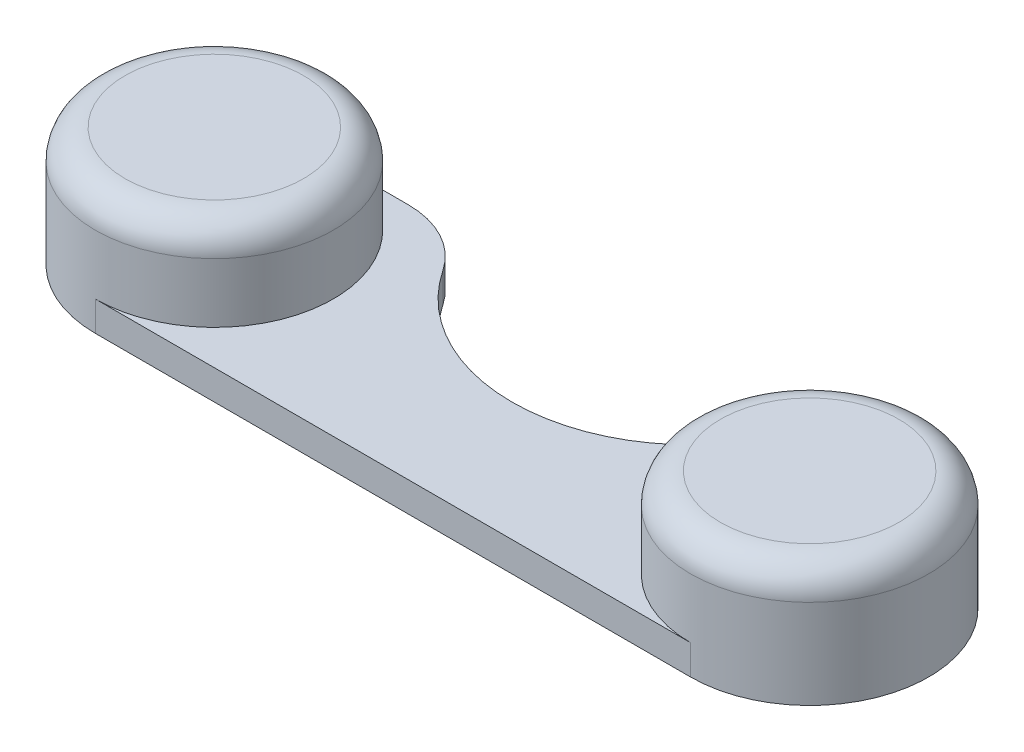
ISO-10303-21;
HEADER;
FILE_DESCRIPTION(('STEP AP214'),'2;1');
FILE_NAME('part.step','',(''),(''),'','','');
FILE_SCHEMA(('AUTOMOTIVE_DESIGN { 1 0 10303 214 1 1 1 1 }'));
ENDSEC;
DATA;
#1=APPLICATION_CONTEXT('core data for automotive mechanical design processes');
#2=APPLICATION_PROTOCOL_DEFINITION('international standard','automotive_design',2000,#1);
#3=PRODUCT_CONTEXT('',#1,'mechanical');
#4=PRODUCT('Part','Part','',(#3));
#5=PRODUCT_RELATED_PRODUCT_CATEGORY('part','',(#4));
#6=PRODUCT_DEFINITION_FORMATION('','',#4);
#7=PRODUCT_DEFINITION_CONTEXT('part definition',#1,'design');
#8=PRODUCT_DEFINITION('design','',#6,#7);
#9=PRODUCT_DEFINITION_SHAPE('','',#8);
#10=(LENGTH_UNIT() NAMED_UNIT(*) SI_UNIT(.MILLI.,.METRE.));
#11=(NAMED_UNIT(*) PLANE_ANGLE_UNIT() SI_UNIT($,.RADIAN.));
#12=(NAMED_UNIT(*) SI_UNIT($,.STERADIAN.) SOLID_ANGLE_UNIT());
#13=UNCERTAINTY_MEASURE_WITH_UNIT(LENGTH_MEASURE(1.E-05),#10,'distance_accuracy_value','');
#14=(GEOMETRIC_REPRESENTATION_CONTEXT(3) GLOBAL_UNCERTAINTY_ASSIGNED_CONTEXT((#13)) GLOBAL_UNIT_ASSIGNED_CONTEXT((#10,
#11,#12)) REPRESENTATION_CONTEXT('',''));
#15=CARTESIAN_POINT('',(0.,0.,0.));
#16=DIRECTION('',(0.,0.,1.));
#17=DIRECTION('',(1.,0.,0.));
#18=AXIS2_PLACEMENT_3D('',#15,#16,#17);
#19=CARTESIAN_POINT('',(0.,1.,-4.));
#20=DIRECTION('',(0.,0.,-1.));
#21=DIRECTION('',(-1.,0.,0.));
#22=AXIS2_PLACEMENT_3D('',#19,#20,#21);
#23=PLANE('',#22);
#24=DIRECTION('',(1.,0.,0.));
#25=VECTOR('',#24,1.);
#26=CARTESIAN_POINT('',(0.,1.,-4.));
#27=LINE('',#26,#25);
#28=CARTESIAN_POINT('',(0.,1.,-4.));
#29=VERTEX_POINT('',#28);
#30=CARTESIAN_POINT('',(2.51668522645212,1.,-4.));
#31=VERTEX_POINT('',#30);
#32=EDGE_CURVE('E127',#29,#31,#27,.T.);
#33=ORIENTED_EDGE('',*,*,#32,.T.);
#34=DIRECTION('',(0.,-1.,0.));
#35=VECTOR('',#34,1.);
#36=CARTESIAN_POINT('',(2.51668522645212,0.,-4.));
#37=LINE('',#36,#35);
#38=CARTESIAN_POINT('',(2.51668522645212,0.,-4.));
#39=VERTEX_POINT('',#38);
#40=EDGE_CURVE('E56',#31,#39,#37,.T.);
#41=ORIENTED_EDGE('',*,*,#40,.T.);
#42=DIRECTION('',(1.,0.,0.));
#43=VECTOR('',#42,1.);
#44=CARTESIAN_POINT('',(0.,0.,-4.));
#45=LINE('',#44,#43);
#46=CARTESIAN_POINT('',(0.,0.,-4.));
#47=VERTEX_POINT('',#46);
#48=EDGE_CURVE('E125',#47,#39,#45,.T.);
#49=ORIENTED_EDGE('',*,*,#48,.F.);
#50=DIRECTION('',(0.,-1.,0.));
#51=VECTOR('',#50,1.);
#52=CARTESIAN_POINT('',(0.,1.,-4.));
#53=LINE('',#52,#51);
#54=EDGE_CURVE('E135',#29,#47,#53,.T.);
#55=ORIENTED_EDGE('',*,*,#54,.F.);
#56=EDGE_LOOP('',(#33,#41,#49,#55));
#57=FACE_BOUND('',#56,.T.);
#58=ADVANCED_FACE('F33',(#57),#23,.T.);
#59=CARTESIAN_POINT('',(0.,4.,0.));
#60=DIRECTION('',(0.,-1.,0.));
#61=DIRECTION('',(0.,0.,-1.));
#62=AXIS2_PLACEMENT_3D('',#59,#60,#61);
#63=CYLINDRICAL_SURFACE('',#62,4.);
#64=CARTESIAN_POINT('',(0.,3.,0.));
#65=DIRECTION('',(0.,1.,0.));
#66=DIRECTION('',(0.,0.,1.));
#67=AXIS2_PLACEMENT_3D('',#64,#65,#66);
#68=CIRCLE('',#67,4.);
#69=CARTESIAN_POINT('',(0.,3.,4.));
#70=VERTEX_POINT('',#69);
#71=EDGE_CURVE('E143',#70,#70,#68,.F.);
#72=ORIENTED_EDGE('',*,*,#71,.T.);
#73=EDGE_LOOP('',(#72));
#74=FACE_BOUND('',#73,.T.);
#75=DIRECTION('',(0.,-1.,0.));
#76=VECTOR('',#75,1.);
#77=CARTESIAN_POINT('',(0.,1.,4.));
#78=LINE('',#77,#76);
#79=CARTESIAN_POINT('',(0.,1.,4.));
#80=VERTEX_POINT('',#79);
#81=CARTESIAN_POINT('',(0.,0.,4.));
#82=VERTEX_POINT('',#81);
#83=EDGE_CURVE('E112',#80,#82,#78,.T.);
#84=ORIENTED_EDGE('',*,*,#83,.F.);
#85=CARTESIAN_POINT('',(0.,1.,0.));
#86=DIRECTION('',(0.,1.,0.));
#87=DIRECTION('',(0.,0.,1.));
#88=AXIS2_PLACEMENT_3D('',#85,#86,#87);
#89=CIRCLE('',#88,4.);
#90=EDGE_CURVE('E146',#80,#29,#89,.T.);
#91=ORIENTED_EDGE('',*,*,#90,.T.);
#92=ORIENTED_EDGE('',*,*,#54,.T.);
#93=CARTESIAN_POINT('',(0.,0.,0.));
#94=DIRECTION('',(0.,1.,0.));
#95=DIRECTION('',(0.,0.,1.));
#96=AXIS2_PLACEMENT_3D('',#93,#94,#95);
#97=CIRCLE('',#96,4.);
#98=EDGE_CURVE('E132',#47,#82,#97,.T.);
#99=ORIENTED_EDGE('',*,*,#98,.T.);
#100=EDGE_LOOP('',(#84,#91,#92,#99));
#101=FACE_BOUND('',#100,.T.);
#102=ADVANCED_FACE('F201',(#74,#101),#63,.T.);
#103=CARTESIAN_POINT('',(0.,4.,0.));
#104=DIRECTION('',(0.,1.,0.));
#105=DIRECTION('',(0.,0.,1.));
#106=AXIS2_PLACEMENT_3D('',#103,#104,#105);
#107=PLANE('',#106);
#108=CARTESIAN_POINT('',(0.,4.,0.));
#109=DIRECTION('',(0.,1.,0.));
#110=DIRECTION('',(0.,0.,1.));
#111=AXIS2_PLACEMENT_3D('',#108,#109,#110);
#112=CIRCLE('',#111,3.);
#113=CARTESIAN_POINT('',(0.,4.,3.));
#114=VERTEX_POINT('',#113);
#115=EDGE_CURVE('E140',#114,#114,#112,.T.);
#116=ORIENTED_EDGE('',*,*,#115,.T.);
#117=EDGE_LOOP('',(#116));
#118=FACE_BOUND('',#117,.T.);
#119=ADVANCED_FACE('F207',(#118),#107,.T.);
#120=CARTESIAN_POINT('',(0.,0.,0.));
#121=DIRECTION('',(0.,1.,0.));
#122=DIRECTION('',(0.,0.,1.));
#123=AXIS2_PLACEMENT_3D('',#120,#121,#122);
#124=PLANE('',#123);
#125=ORIENTED_EDGE('',*,*,#48,.T.);
#126=CARTESIAN_POINT('',(2.51668522645212,0.,-1.));
#127=DIRECTION('',(0.,1.,0.));
#128=DIRECTION('',(0.,0.,1.));
#129=AXIS2_PLACEMENT_3D('',#126,#127,#128);
#130=CIRCLE('',#129,3.);
#131=CARTESIAN_POINT('',(5.01112348430141,0.,-2.66666666666667));
#132=VERTEX_POINT('',#131);
#133=EDGE_CURVE('E41',#39,#132,#130,.F.);
#134=ORIENTED_EDGE('',*,*,#133,.T.);
#135=CARTESIAN_POINT('',(10.,0.,-6.));
#136=DIRECTION('',(0.,1.,0.));
#137=DIRECTION('',(0.,0.,1.));
#138=AXIS2_PLACEMENT_3D('',#135,#136,#137);
#139=CIRCLE('',#138,6.);
#140=CARTESIAN_POINT('',(14.9888765156986,0.,-2.66666666666667));
#141=VERTEX_POINT('',#140);
#142=EDGE_CURVE('E120',#141,#132,#139,.F.);
#143=ORIENTED_EDGE('',*,*,#142,.F.);
#144=CARTESIAN_POINT('',(17.4833147735479,0.,-1.));
#145=DIRECTION('',(0.,1.,0.));
#146=DIRECTION('',(0.,0.,1.));
#147=AXIS2_PLACEMENT_3D('',#144,#145,#146);
#148=CIRCLE('',#147,3.);
#149=CARTESIAN_POINT('',(17.4833147735479,0.,-4.));
#150=VERTEX_POINT('',#149);
#151=EDGE_CURVE('E48',#141,#150,#148,.F.);
#152=ORIENTED_EDGE('',*,*,#151,.T.);
#153=CARTESIAN_POINT('',(20.,0.,-4.));
#154=VERTEX_POINT('',#153);
#155=EDGE_CURVE('E118',#150,#154,#45,.T.);
#156=ORIENTED_EDGE('',*,*,#155,.T.);
#157=CARTESIAN_POINT('',(20.,0.,0.));
#158=DIRECTION('',(0.,1.,0.));
#159=DIRECTION('',(0.,0.,1.));
#160=AXIS2_PLACEMENT_3D('',#157,#158,#159);
#161=CIRCLE('',#160,4.);
#162=CARTESIAN_POINT('',(20.,0.,4.));
#163=VERTEX_POINT('',#162);
#164=EDGE_CURVE('E104',#163,#154,#161,.T.);
#165=ORIENTED_EDGE('',*,*,#164,.F.);
#166=DIRECTION('',(-1.,0.,0.));
#167=VECTOR('',#166,1.);
#168=CARTESIAN_POINT('',(0.,0.,4.));
#169=LINE('',#168,#167);
#170=EDGE_CURVE('E117',#163,#82,#169,.T.);
#171=ORIENTED_EDGE('',*,*,#170,.T.);
#172=ORIENTED_EDGE('',*,*,#98,.F.);
#173=EDGE_LOOP('',(#125,#134,#143,#152,#156,#165,#171,#172));
#174=FACE_BOUND('',#173,.T.);
#175=ADVANCED_FACE('F116',(#174),#124,.F.);
#176=CARTESIAN_POINT('',(0.,3.,0.));
#177=DIRECTION('',(0.,1.,0.));
#178=DIRECTION('',(0.,0.,1.));
#179=AXIS2_PLACEMENT_3D('',#176,#177,#178);
#180=TOROIDAL_SURFACE('',#179,3.,1.);
#181=ORIENTED_EDGE('',*,*,#71,.F.);
#182=EDGE_LOOP('',(#181));
#183=FACE_BOUND('',#182,.T.);
#184=ORIENTED_EDGE('',*,*,#115,.F.);
#185=EDGE_LOOP('',(#184));
#186=FACE_BOUND('',#185,.T.);
#187=ADVANCED_FACE('F218',(#183,#186),#180,.T.);
#188=CARTESIAN_POINT('',(0.,1.,4.));
#189=DIRECTION('',(0.,0.,1.));
#190=DIRECTION('',(1.,0.,0.));
#191=AXIS2_PLACEMENT_3D('',#188,#189,#190);
#192=PLANE('',#191);
#193=ORIENTED_EDGE('',*,*,#170,.F.);
#194=DIRECTION('',(0.,-1.,0.));
#195=VECTOR('',#194,1.);
#196=CARTESIAN_POINT('',(20.,1.,4.));
#197=LINE('',#196,#195);
#198=CARTESIAN_POINT('',(20.,1.,4.));
#199=VERTEX_POINT('',#198);
#200=EDGE_CURVE('E99',#199,#163,#197,.T.);
#201=ORIENTED_EDGE('',*,*,#200,.F.);
#202=DIRECTION('',(-1.,0.,0.));
#203=VECTOR('',#202,1.);
#204=CARTESIAN_POINT('',(0.,1.,4.));
#205=LINE('',#204,#203);
#206=EDGE_CURVE('E138',#199,#80,#205,.T.);
#207=ORIENTED_EDGE('',*,*,#206,.T.);
#208=ORIENTED_EDGE('',*,*,#83,.T.);
#209=EDGE_LOOP('',(#193,#201,#207,#208));
#210=FACE_BOUND('',#209,.T.);
#211=ADVANCED_FACE('F123',(#210),#192,.T.);
#212=ORIENTED_EDGE('',*,*,#155,.F.);
#213=DIRECTION('',(0.,-1.,0.));
#214=VECTOR('',#213,1.);
#215=CARTESIAN_POINT('',(17.4833147735479,1.,-4.));
#216=LINE('',#215,#214);
#217=CARTESIAN_POINT('',(17.4833147735479,1.,-4.));
#218=VERTEX_POINT('',#217);
#219=EDGE_CURVE('E11',#150,#218,#216,.F.);
#220=ORIENTED_EDGE('',*,*,#219,.T.);
#221=CARTESIAN_POINT('',(20.,1.,-4.));
#222=VERTEX_POINT('',#221);
#223=EDGE_CURVE('E124',#218,#222,#27,.T.);
#224=ORIENTED_EDGE('',*,*,#223,.T.);
#225=DIRECTION('',(0.,-1.,0.));
#226=VECTOR('',#225,1.);
#227=CARTESIAN_POINT('',(20.,1.,-4.));
#228=LINE('',#227,#226);
#229=EDGE_CURVE('E113',#222,#154,#228,.T.);
#230=ORIENTED_EDGE('',*,*,#229,.T.);
#231=EDGE_LOOP('',(#212,#220,#224,#230));
#232=FACE_BOUND('',#231,.T.);
#233=ADVANCED_FACE('F203',(#232),#23,.T.);
#234=CARTESIAN_POINT('',(0.,1.,0.));
#235=DIRECTION('',(0.,1.,0.));
#236=DIRECTION('',(0.,0.,1.));
#237=AXIS2_PLACEMENT_3D('',#234,#235,#236);
#238=PLANE('',#237);
#239=CARTESIAN_POINT('',(10.,1.,-6.));
#240=DIRECTION('',(0.,1.,0.));
#241=DIRECTION('',(0.,0.,1.));
#242=AXIS2_PLACEMENT_3D('',#239,#240,#241);
#243=CIRCLE('',#242,6.);
#244=CARTESIAN_POINT('',(5.01112348430141,1.,-2.66666666666667));
#245=VERTEX_POINT('',#244);
#246=CARTESIAN_POINT('',(14.9888765156986,1.,-2.66666666666667));
#247=VERTEX_POINT('',#246);
#248=EDGE_CURVE('E149',#245,#247,#243,.T.);
#249=ORIENTED_EDGE('',*,*,#248,.F.);
#250=CARTESIAN_POINT('',(2.51668522645212,1.,-1.));
#251=DIRECTION('',(0.,1.,0.));
#252=DIRECTION('',(0.,0.,1.));
#253=AXIS2_PLACEMENT_3D('',#250,#251,#252);
#254=CIRCLE('',#253,3.);
#255=EDGE_CURVE('E160',#245,#31,#254,.T.);
#256=ORIENTED_EDGE('',*,*,#255,.T.);
#257=ORIENTED_EDGE('',*,*,#32,.F.);
#258=ORIENTED_EDGE('',*,*,#90,.F.);
#259=ORIENTED_EDGE('',*,*,#206,.F.);
#260=CARTESIAN_POINT('',(20.,1.,0.));
#261=DIRECTION('',(0.,1.,0.));
#262=DIRECTION('',(0.,0.,1.));
#263=AXIS2_PLACEMENT_3D('',#260,#261,#262);
#264=CIRCLE('',#263,4.);
#265=EDGE_CURVE('E107',#199,#222,#264,.F.);
#266=ORIENTED_EDGE('',*,*,#265,.T.);
#267=ORIENTED_EDGE('',*,*,#223,.F.);
#268=CARTESIAN_POINT('',(17.4833147735479,1.,-1.));
#269=DIRECTION('',(0.,1.,0.));
#270=DIRECTION('',(0.,0.,1.));
#271=AXIS2_PLACEMENT_3D('',#268,#269,#270);
#272=CIRCLE('',#271,3.);
#273=EDGE_CURVE('E158',#218,#247,#272,.T.);
#274=ORIENTED_EDGE('',*,*,#273,.T.);
#275=EDGE_LOOP('',(#249,#256,#257,#258,#259,#266,#267,#274));
#276=FACE_BOUND('',#275,.T.);
#277=ADVANCED_FACE('F175',(#276),#238,.T.);
#278=CARTESIAN_POINT('',(20.,4.,0.));
#279=DIRECTION('',(0.,-1.,0.));
#280=DIRECTION('',(0.,0.,-1.));
#281=AXIS2_PLACEMENT_3D('',#278,#279,#280);
#282=CYLINDRICAL_SURFACE('',#281,4.);
#283=ORIENTED_EDGE('',*,*,#200,.T.);
#284=ORIENTED_EDGE('',*,*,#164,.T.);
#285=ORIENTED_EDGE('',*,*,#229,.F.);
#286=ORIENTED_EDGE('',*,*,#265,.F.);
#287=EDGE_LOOP('',(#283,#284,#285,#286));
#288=FACE_BOUND('',#287,.T.);
#289=CARTESIAN_POINT('',(20.,3.,0.));
#290=DIRECTION('',(0.,1.,0.));
#291=DIRECTION('',(0.,0.,1.));
#292=AXIS2_PLACEMENT_3D('',#289,#290,#291);
#293=CIRCLE('',#292,4.);
#294=CARTESIAN_POINT('',(20.,3.,4.));
#295=VERTEX_POINT('',#294);
#296=EDGE_CURVE('E179',#295,#295,#293,.F.);
#297=ORIENTED_EDGE('',*,*,#296,.T.);
#298=EDGE_LOOP('',(#297));
#299=FACE_BOUND('',#298,.T.);
#300=ADVANCED_FACE('F101',(#288,#299),#282,.T.);
#301=CARTESIAN_POINT('',(20.,4.,0.));
#302=DIRECTION('',(0.,1.,0.));
#303=DIRECTION('',(0.,0.,1.));
#304=AXIS2_PLACEMENT_3D('',#301,#302,#303);
#305=PLANE('',#304);
#306=CARTESIAN_POINT('',(20.,4.,0.));
#307=DIRECTION('',(0.,1.,0.));
#308=DIRECTION('',(0.,0.,1.));
#309=AXIS2_PLACEMENT_3D('',#306,#307,#308);
#310=CIRCLE('',#309,3.);
#311=CARTESIAN_POINT('',(20.,4.,3.));
#312=VERTEX_POINT('',#311);
#313=EDGE_CURVE('E119',#312,#312,#310,.T.);
#314=ORIENTED_EDGE('',*,*,#313,.T.);
#315=EDGE_LOOP('',(#314));
#316=FACE_BOUND('',#315,.T.);
#317=ADVANCED_FACE('F185',(#316),#305,.T.);
#318=CARTESIAN_POINT('',(20.,3.,0.));
#319=DIRECTION('',(0.,1.,0.));
#320=DIRECTION('',(0.,0.,1.));
#321=AXIS2_PLACEMENT_3D('',#318,#319,#320);
#322=TOROIDAL_SURFACE('',#321,3.,1.);
#323=ORIENTED_EDGE('',*,*,#296,.F.);
#324=EDGE_LOOP('',(#323));
#325=FACE_BOUND('',#324,.T.);
#326=ORIENTED_EDGE('',*,*,#313,.F.);
#327=EDGE_LOOP('',(#326));
#328=FACE_BOUND('',#327,.T.);
#329=ADVANCED_FACE('F187',(#325,#328),#322,.T.);
#330=CARTESIAN_POINT('',(10.,-16.9705627484771,-6.));
#331=DIRECTION('',(0.,1.,0.));
#332=DIRECTION('',(0.,0.,1.));
#333=AXIS2_PLACEMENT_3D('',#330,#331,#332);
#334=CYLINDRICAL_SURFACE('',#333,6.);
#335=ORIENTED_EDGE('',*,*,#142,.T.);
#336=DIRECTION('',(0.,1.,0.));
#337=VECTOR('',#336,1.);
#338=CARTESIAN_POINT('',(5.01112348430141,-16.9705627484771,-2.66666666666667));
#339=LINE('',#338,#337);
#340=EDGE_CURVE('E155',#132,#245,#339,.T.);
#341=ORIENTED_EDGE('',*,*,#340,.T.);
#342=ORIENTED_EDGE('',*,*,#248,.T.);
#343=DIRECTION('',(0.,1.,0.));
#344=VECTOR('',#343,1.);
#345=CARTESIAN_POINT('',(14.9888765156986,-16.9705627484771,-2.66666666666667));
#346=LINE('',#345,#344);
#347=EDGE_CURVE('E152',#247,#141,#346,.F.);
#348=ORIENTED_EDGE('',*,*,#347,.T.);
#349=EDGE_LOOP('',(#335,#341,#342,#348));
#350=FACE_BOUND('',#349,.T.);
#351=ADVANCED_FACE('F168',(#350),#334,.F.);
#352=CARTESIAN_POINT('',(2.51668522645212,-16.9705627484771,-1.));
#353=DIRECTION('',(0.,1.,0.));
#354=DIRECTION('',(0.,0.,1.));
#355=AXIS2_PLACEMENT_3D('',#352,#353,#354);
#356=CYLINDRICAL_SURFACE('',#355,3.);
#357=ORIENTED_EDGE('',*,*,#133,.F.);
#358=ORIENTED_EDGE('',*,*,#40,.F.);
#359=ORIENTED_EDGE('',*,*,#255,.F.);
#360=ORIENTED_EDGE('',*,*,#340,.F.);
#361=EDGE_LOOP('',(#357,#358,#359,#360));
#362=FACE_BOUND('',#361,.T.);
#363=ADVANCED_FACE('F172',(#362),#356,.T.);
#364=CARTESIAN_POINT('',(17.4833147735479,-16.9705627484771,-1.));
#365=DIRECTION('',(0.,1.,0.));
#366=DIRECTION('',(0.,0.,1.));
#367=AXIS2_PLACEMENT_3D('',#364,#365,#366);
#368=CYLINDRICAL_SURFACE('',#367,3.);
#369=ORIENTED_EDGE('',*,*,#273,.F.);
#370=ORIENTED_EDGE('',*,*,#219,.F.);
#371=ORIENTED_EDGE('',*,*,#151,.F.);
#372=ORIENTED_EDGE('',*,*,#347,.F.);
#373=EDGE_LOOP('',(#369,#370,#371,#372));
#374=FACE_BOUND('',#373,.T.);
#375=ADVANCED_FACE('F35',(#374),#368,.T.);
#376=CLOSED_SHELL('',(#58,#102,#119,#175,#187,#211,#233,#277,#300,#317,#329,#351,#363,#375));
#377=MANIFOLD_SOLID_BREP('B2',#376);
#378=ADVANCED_BREP_SHAPE_REPRESENTATION('',(#18,#377),#14);
#379=SHAPE_DEFINITION_REPRESENTATION(#9,#378);
ENDSEC;
END-ISO-10303-21;
